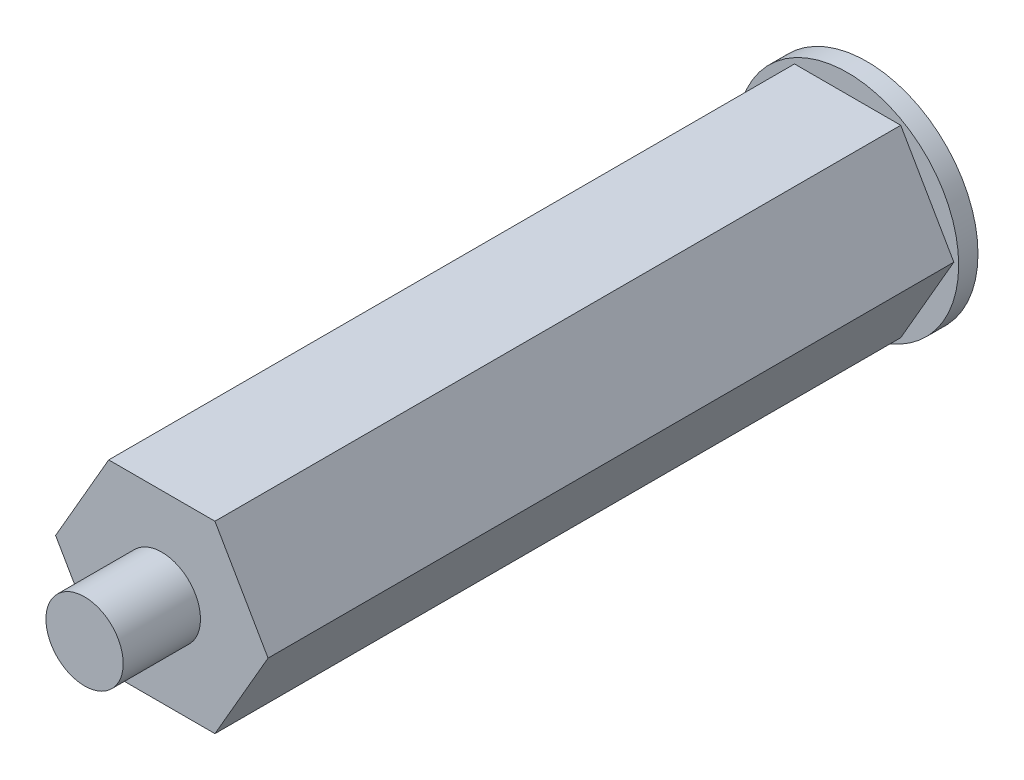
ISO-10303-21;
HEADER;
FILE_DESCRIPTION(('STEP AP214'),'2;1');
FILE_NAME('part.step','',(''),(''),'','','');
FILE_SCHEMA(('AUTOMOTIVE_DESIGN { 1 0 10303 214 1 1 1 1 }'));
ENDSEC;
DATA;
#1=APPLICATION_CONTEXT('core data for automotive mechanical design processes');
#2=APPLICATION_PROTOCOL_DEFINITION('international standard','automotive_design',2000,#1);
#3=PRODUCT_CONTEXT('',#1,'mechanical');
#4=PRODUCT('Part','Part','',(#3));
#5=PRODUCT_RELATED_PRODUCT_CATEGORY('part','',(#4));
#6=PRODUCT_DEFINITION_FORMATION('','',#4);
#7=PRODUCT_DEFINITION_CONTEXT('part definition',#1,'design');
#8=PRODUCT_DEFINITION('design','',#6,#7);
#9=PRODUCT_DEFINITION_SHAPE('','',#8);
#10=(LENGTH_UNIT() NAMED_UNIT(*) SI_UNIT(.MILLI.,.METRE.));
#11=(NAMED_UNIT(*) PLANE_ANGLE_UNIT() SI_UNIT($,.RADIAN.));
#12=(NAMED_UNIT(*) SI_UNIT($,.STERADIAN.) SOLID_ANGLE_UNIT());
#13=UNCERTAINTY_MEASURE_WITH_UNIT(LENGTH_MEASURE(1.E-05),#10,'distance_accuracy_value','');
#14=(GEOMETRIC_REPRESENTATION_CONTEXT(3) GLOBAL_UNCERTAINTY_ASSIGNED_CONTEXT((#13)) GLOBAL_UNIT_ASSIGNED_CONTEXT((#10,
#11,#12)) REPRESENTATION_CONTEXT('',''));
#15=CARTESIAN_POINT('',(0.,0.,0.));
#16=DIRECTION('',(0.,0.,1.));
#17=DIRECTION('',(1.,0.,0.));
#18=AXIS2_PLACEMENT_3D('',#15,#16,#17);
#19=CARTESIAN_POINT('',(0.,0.,-35.5));
#20=DIRECTION('',(0.,0.,1.));
#21=DIRECTION('',(1.,0.,0.));
#22=AXIS2_PLACEMENT_3D('',#19,#20,#21);
#23=PLANE('',#22);
#24=DIRECTION('',(0.5,0.866025403784438,0.));
#25=VECTOR('',#24,1.);
#26=CARTESIAN_POINT('',(-7.1014083110324,0.,-35.5));
#27=LINE('',#26,#25);
#28=CARTESIAN_POINT('',(-7.1014083110324,0.,-35.5));
#29=VERTEX_POINT('',#28);
#30=CARTESIAN_POINT('',(-3.5507041555162,6.15,-35.5));
#31=VERTEX_POINT('',#30);
#32=EDGE_CURVE('E275',#29,#31,#27,.T.);
#33=ORIENTED_EDGE('',*,*,#32,.F.);
#34=DIRECTION('',(-0.5,0.866025403784439,0.));
#35=VECTOR('',#34,1.);
#36=CARTESIAN_POINT('',(-3.5507041555162,-6.15,-35.5));
#37=LINE('',#36,#35);
#38=CARTESIAN_POINT('',(-3.5507041555162,-6.15,-35.5));
#39=VERTEX_POINT('',#38);
#40=EDGE_CURVE('E56',#39,#29,#37,.T.);
#41=ORIENTED_EDGE('',*,*,#40,.F.);
#42=DIRECTION('',(-1.,0.,0.));
#43=VECTOR('',#42,1.);
#44=CARTESIAN_POINT('',(3.5507041555162,-6.15,-35.5));
#45=LINE('',#44,#43);
#46=CARTESIAN_POINT('',(3.5507041555162,-6.15,-35.5));
#47=VERTEX_POINT('',#46);
#48=EDGE_CURVE('E295',#47,#39,#45,.T.);
#49=ORIENTED_EDGE('',*,*,#48,.F.);
#50=DIRECTION('',(-0.5,-0.866025403784438,0.));
#51=VECTOR('',#50,1.);
#52=CARTESIAN_POINT('',(7.1014083110324,0.,-35.5));
#53=LINE('',#52,#51);
#54=CARTESIAN_POINT('',(7.1014083110324,0.,-35.5));
#55=VERTEX_POINT('',#54);
#56=EDGE_CURVE('E289',#55,#47,#53,.T.);
#57=ORIENTED_EDGE('',*,*,#56,.F.);
#58=DIRECTION('',(0.5,-0.866025403784438,0.));
#59=VECTOR('',#58,1.);
#60=CARTESIAN_POINT('',(3.5507041555162,6.15,-35.5));
#61=LINE('',#60,#59);
#62=CARTESIAN_POINT('',(3.5507041555162,6.15,-35.5));
#63=VERTEX_POINT('',#62);
#64=EDGE_CURVE('E287',#63,#55,#61,.T.);
#65=ORIENTED_EDGE('',*,*,#64,.F.);
#66=DIRECTION('',(1.,0.,0.));
#67=VECTOR('',#66,1.);
#68=CARTESIAN_POINT('',(-3.5507041555162,6.15,-35.5));
#69=LINE('',#68,#67);
#70=EDGE_CURVE('E281',#31,#63,#69,.T.);
#71=ORIENTED_EDGE('',*,*,#70,.F.);
#72=EDGE_LOOP('',(#33,#41,#49,#57,#65,#71));
#73=FACE_BOUND('',#72,.T.);
#74=CARTESIAN_POINT('',(0.,0.,-35.5));
#75=DIRECTION('',(0.,0.,-1.));
#76=DIRECTION('',(-1.,0.,0.));
#77=AXIS2_PLACEMENT_3D('',#74,#75,#76);
#78=CIRCLE('',#77,8.5);
#79=CARTESIAN_POINT('',(-8.5,0.,-35.5));
#80=VERTEX_POINT('',#79);
#81=EDGE_CURVE('E327',#80,#80,#78,.T.);
#82=ORIENTED_EDGE('',*,*,#81,.T.);
#83=EDGE_LOOP('',(#82));
#84=FACE_BOUND('',#83,.T.);
#85=ADVANCED_FACE('F39',(#73,#84),#23,.F.);
#86=CARTESIAN_POINT('',(-3.5507041555162,-6.15,-29.5));
#87=DIRECTION('',(-0.866025403784439,-0.5,0.));
#88=DIRECTION('',(0.5,-0.866025403784439,0.));
#89=AXIS2_PLACEMENT_3D('',#86,#87,#88);
#90=PLANE('',#89);
#91=ORIENTED_EDGE('',*,*,#40,.T.);
#92=DIRECTION('',(0.,0.,-1.));
#93=VECTOR('',#92,1.);
#94=CARTESIAN_POINT('',(-7.1014083110324,0.,-29.5));
#95=LINE('',#94,#93);
#96=CARTESIAN_POINT('',(-7.1014083110324,0.,-29.5));
#97=VERTEX_POINT('',#96);
#98=EDGE_CURVE('E280',#97,#29,#95,.T.);
#99=ORIENTED_EDGE('',*,*,#98,.F.);
#100=DIRECTION('',(-0.5,0.866025403784439,0.));
#101=VECTOR('',#100,1.);
#102=CARTESIAN_POINT('',(-3.5507041555162,-6.15,-29.5));
#103=LINE('',#102,#101);
#104=CARTESIAN_POINT('',(-3.5507041555162,-6.15,-29.5));
#105=VERTEX_POINT('',#104);
#106=EDGE_CURVE('E298',#105,#97,#103,.T.);
#107=ORIENTED_EDGE('',*,*,#106,.F.);
#108=DIRECTION('',(0.,0.,-1.));
#109=VECTOR('',#108,1.);
#110=CARTESIAN_POINT('',(-3.5507041555162,-6.15,-29.5));
#111=LINE('',#110,#109);
#112=EDGE_CURVE('E299',#105,#39,#111,.T.);
#113=ORIENTED_EDGE('',*,*,#112,.T.);
#114=EDGE_LOOP('',(#91,#99,#107,#113));
#115=FACE_BOUND('',#114,.T.);
#116=ADVANCED_FACE('F204',(#115),#90,.F.);
#117=CARTESIAN_POINT('',(3.5507041555162,-6.15,-29.5));
#118=DIRECTION('',(0.,-1.,0.));
#119=DIRECTION('',(1.,0.,0.));
#120=AXIS2_PLACEMENT_3D('',#117,#118,#119);
#121=PLANE('',#120);
#122=ORIENTED_EDGE('',*,*,#48,.T.);
#123=ORIENTED_EDGE('',*,*,#112,.F.);
#124=DIRECTION('',(-1.,0.,0.));
#125=VECTOR('',#124,1.);
#126=CARTESIAN_POINT('',(3.5507041555162,-6.15,-29.5));
#127=LINE('',#126,#125);
#128=CARTESIAN_POINT('',(3.5507041555162,-6.15,-29.5));
#129=VERTEX_POINT('',#128);
#130=EDGE_CURVE('E308',#129,#105,#127,.T.);
#131=ORIENTED_EDGE('',*,*,#130,.F.);
#132=DIRECTION('',(0.,0.,-1.));
#133=VECTOR('',#132,1.);
#134=CARTESIAN_POINT('',(3.5507041555162,-6.15,-29.5));
#135=LINE('',#134,#133);
#136=EDGE_CURVE('E301',#129,#47,#135,.T.);
#137=ORIENTED_EDGE('',*,*,#136,.T.);
#138=EDGE_LOOP('',(#122,#123,#131,#137));
#139=FACE_BOUND('',#138,.T.);
#140=ADVANCED_FACE('F212',(#139),#121,.F.);
#141=CARTESIAN_POINT('',(7.1014083110324,0.,-29.5));
#142=DIRECTION('',(0.866025403784438,-0.5,0.));
#143=DIRECTION('',(0.5,0.866025403784438,0.));
#144=AXIS2_PLACEMENT_3D('',#141,#142,#143);
#145=PLANE('',#144);
#146=ORIENTED_EDGE('',*,*,#56,.T.);
#147=ORIENTED_EDGE('',*,*,#136,.F.);
#148=DIRECTION('',(-0.5,-0.866025403784438,0.));
#149=VECTOR('',#148,1.);
#150=CARTESIAN_POINT('',(7.1014083110324,0.,-29.5));
#151=LINE('',#150,#149);
#152=CARTESIAN_POINT('',(7.1014083110324,0.,-29.5));
#153=VERTEX_POINT('',#152);
#154=EDGE_CURVE('E310',#153,#129,#151,.T.);
#155=ORIENTED_EDGE('',*,*,#154,.F.);
#156=DIRECTION('',(0.,0.,-1.));
#157=VECTOR('',#156,1.);
#158=CARTESIAN_POINT('',(7.1014083110324,0.,-29.5));
#159=LINE('',#158,#157);
#160=EDGE_CURVE('E303',#153,#55,#159,.T.);
#161=ORIENTED_EDGE('',*,*,#160,.T.);
#162=EDGE_LOOP('',(#146,#147,#155,#161));
#163=FACE_BOUND('',#162,.T.);
#164=ADVANCED_FACE('F257',(#163),#145,.F.);
#165=CARTESIAN_POINT('',(3.5507041555162,6.15,-29.5));
#166=DIRECTION('',(0.866025403784439,0.5,0.));
#167=DIRECTION('',(-0.5,0.866025403784439,0.));
#168=AXIS2_PLACEMENT_3D('',#165,#166,#167);
#169=PLANE('',#168);
#170=ORIENTED_EDGE('',*,*,#64,.T.);
#171=ORIENTED_EDGE('',*,*,#160,.F.);
#172=DIRECTION('',(0.5,-0.866025403784438,0.));
#173=VECTOR('',#172,1.);
#174=CARTESIAN_POINT('',(3.5507041555162,6.15,-29.5));
#175=LINE('',#174,#173);
#176=CARTESIAN_POINT('',(3.5507041555162,6.15,-29.5));
#177=VERTEX_POINT('',#176);
#178=EDGE_CURVE('E315',#177,#153,#175,.T.);
#179=ORIENTED_EDGE('',*,*,#178,.F.);
#180=DIRECTION('',(0.,0.,-1.));
#181=VECTOR('',#180,1.);
#182=CARTESIAN_POINT('',(3.5507041555162,6.15,-29.5));
#183=LINE('',#182,#181);
#184=EDGE_CURVE('E305',#177,#63,#183,.T.);
#185=ORIENTED_EDGE('',*,*,#184,.T.);
#186=EDGE_LOOP('',(#170,#171,#179,#185));
#187=FACE_BOUND('',#186,.T.);
#188=ADVANCED_FACE('F261',(#187),#169,.F.);
#189=CARTESIAN_POINT('',(-3.5507041555162,6.15,-29.5));
#190=DIRECTION('',(0.,1.,0.));
#191=DIRECTION('',(0.,0.,1.));
#192=AXIS2_PLACEMENT_3D('',#189,#190,#191);
#193=PLANE('',#192);
#194=ORIENTED_EDGE('',*,*,#70,.T.);
#195=ORIENTED_EDGE('',*,*,#184,.F.);
#196=DIRECTION('',(1.,0.,0.));
#197=VECTOR('',#196,1.);
#198=CARTESIAN_POINT('',(-3.5507041555162,6.15,-29.5));
#199=LINE('',#198,#197);
#200=CARTESIAN_POINT('',(-3.5507041555162,6.15,-29.5));
#201=VERTEX_POINT('',#200);
#202=EDGE_CURVE('E334',#201,#177,#199,.T.);
#203=ORIENTED_EDGE('',*,*,#202,.F.);
#204=DIRECTION('',(0.,0.,-1.));
#205=VECTOR('',#204,1.);
#206=CARTESIAN_POINT('',(-3.5507041555162,6.15,-29.5));
#207=LINE('',#206,#205);
#208=EDGE_CURVE('E278',#201,#31,#207,.T.);
#209=ORIENTED_EDGE('',*,*,#208,.T.);
#210=EDGE_LOOP('',(#194,#195,#203,#209));
#211=FACE_BOUND('',#210,.T.);
#212=ADVANCED_FACE('F265',(#211),#193,.F.);
#213=CARTESIAN_POINT('',(-7.1014083110324,0.,-29.5));
#214=DIRECTION('',(-0.866025403784439,0.5,0.));
#215=DIRECTION('',(-0.5,-0.866025403784439,0.));
#216=AXIS2_PLACEMENT_3D('',#213,#214,#215);
#217=PLANE('',#216);
#218=ORIENTED_EDGE('',*,*,#32,.T.);
#219=ORIENTED_EDGE('',*,*,#208,.F.);
#220=DIRECTION('',(0.5,0.866025403784438,0.));
#221=VECTOR('',#220,1.);
#222=CARTESIAN_POINT('',(-7.1014083110324,0.,-29.5));
#223=LINE('',#222,#221);
#224=EDGE_CURVE('E331',#97,#201,#223,.T.);
#225=ORIENTED_EDGE('',*,*,#224,.F.);
#226=ORIENTED_EDGE('',*,*,#98,.T.);
#227=EDGE_LOOP('',(#218,#219,#225,#226));
#228=FACE_BOUND('',#227,.T.);
#229=ADVANCED_FACE('F253',(#228),#217,.F.);
#230=CARTESIAN_POINT('',(0.,0.,-29.5));
#231=DIRECTION('',(0.,0.,-1.));
#232=DIRECTION('',(-1.,0.,0.));
#233=AXIS2_PLACEMENT_3D('',#230,#231,#232);
#234=PLANE('',#233);
#235=ORIENTED_EDGE('',*,*,#106,.T.);
#236=ORIENTED_EDGE('',*,*,#224,.T.);
#237=ORIENTED_EDGE('',*,*,#202,.T.);
#238=ORIENTED_EDGE('',*,*,#178,.T.);
#239=ORIENTED_EDGE('',*,*,#154,.T.);
#240=ORIENTED_EDGE('',*,*,#130,.T.);
#241=EDGE_LOOP('',(#235,#236,#237,#238,#239,#240));
#242=FACE_BOUND('',#241,.T.);
#243=ADVANCED_FACE('F245',(#242),#234,.T.);
#244=CARTESIAN_POINT('',(0.,0.,-37.5));
#245=DIRECTION('',(0.,0.,-1.));
#246=DIRECTION('',(-1.,0.,0.));
#247=AXIS2_PLACEMENT_3D('',#244,#245,#246);
#248=PLANE('',#247);
#249=CARTESIAN_POINT('',(0.,0.,-37.5));
#250=DIRECTION('',(0.,0.,-1.));
#251=DIRECTION('',(-1.,0.,0.));
#252=AXIS2_PLACEMENT_3D('',#249,#250,#251);
#253=CIRCLE('',#252,11.5);
#254=CARTESIAN_POINT('',(-11.5,0.,-37.5));
#255=VERTEX_POINT('',#254);
#256=EDGE_CURVE('E318',#255,#255,#253,.T.);
#257=ORIENTED_EDGE('',*,*,#256,.T.);
#258=EDGE_LOOP('',(#257));
#259=FACE_BOUND('',#258,.T.);
#260=CARTESIAN_POINT('',(0.,0.,-37.5));
#261=DIRECTION('',(0.,0.,-1.));
#262=DIRECTION('',(-1.,0.,0.));
#263=AXIS2_PLACEMENT_3D('',#260,#261,#262);
#264=CIRCLE('',#263,8.5);
#265=CARTESIAN_POINT('',(-8.5,0.,-37.5));
#266=VERTEX_POINT('',#265);
#267=EDGE_CURVE('E324',#266,#266,#264,.T.);
#268=ORIENTED_EDGE('',*,*,#267,.F.);
#269=EDGE_LOOP('',(#268));
#270=FACE_BOUND('',#269,.T.);
#271=ADVANCED_FACE('F243',(#259,#270),#248,.T.);
#272=CARTESIAN_POINT('',(0.,0.,-35.5));
#273=DIRECTION('',(0.,0.,-1.));
#274=DIRECTION('',(-1.,0.,0.));
#275=AXIS2_PLACEMENT_3D('',#272,#273,#274);
#276=PLANE('',#275);
#277=DIRECTION('',(0.499999999999999,0.866025403784439,0.));
#278=VECTOR('',#277,1.);
#279=CARTESIAN_POINT('',(5.49926131403118,-9.525,-35.5));
#280=LINE('',#279,#278);
#281=CARTESIAN_POINT('',(5.49926131403118,-9.525,-35.5));
#282=VERTEX_POINT('',#281);
#283=CARTESIAN_POINT('',(10.9985226280624,0.,-35.5));
#284=VERTEX_POINT('',#283);
#285=EDGE_CURVE('E133',#282,#284,#280,.T.);
#286=ORIENTED_EDGE('',*,*,#285,.F.);
#287=DIRECTION('',(1.,0.,0.));
#288=VECTOR('',#287,1.);
#289=CARTESIAN_POINT('',(-5.49926131403118,-9.525,-35.5));
#290=LINE('',#289,#288);
#291=CARTESIAN_POINT('',(-5.49926131403118,-9.525,-35.5));
#292=VERTEX_POINT('',#291);
#293=EDGE_CURVE('E145',#292,#282,#290,.T.);
#294=ORIENTED_EDGE('',*,*,#293,.F.);
#295=DIRECTION('',(0.5,-0.866025403784438,0.));
#296=VECTOR('',#295,1.);
#297=CARTESIAN_POINT('',(-10.9985226280624,0.,-35.5));
#298=LINE('',#297,#296);
#299=CARTESIAN_POINT('',(-10.9985226280624,0.,-35.5));
#300=VERTEX_POINT('',#299);
#301=EDGE_CURVE('E158',#300,#292,#298,.T.);
#302=ORIENTED_EDGE('',*,*,#301,.F.);
#303=DIRECTION('',(-0.5,-0.866025403784439,0.));
#304=VECTOR('',#303,1.);
#305=CARTESIAN_POINT('',(-5.49926131403119,9.525,-35.5));
#306=LINE('',#305,#304);
#307=CARTESIAN_POINT('',(-5.49926131403119,9.525,-35.5));
#308=VERTEX_POINT('',#307);
#309=EDGE_CURVE('E155',#308,#300,#306,.T.);
#310=ORIENTED_EDGE('',*,*,#309,.F.);
#311=DIRECTION('',(-1.,0.,0.));
#312=VECTOR('',#311,1.);
#313=CARTESIAN_POINT('',(5.49926131403118,9.525,-35.5));
#314=LINE('',#313,#312);
#315=CARTESIAN_POINT('',(5.49926131403118,9.525,-35.5));
#316=VERTEX_POINT('',#315);
#317=EDGE_CURVE('E64',#316,#308,#314,.T.);
#318=ORIENTED_EDGE('',*,*,#317,.F.);
#319=DIRECTION('',(-0.5,0.866025403784439,0.));
#320=VECTOR('',#319,1.);
#321=CARTESIAN_POINT('',(10.9985226280624,0.,-35.5));
#322=LINE('',#321,#320);
#323=EDGE_CURVE('E128',#284,#316,#322,.T.);
#324=ORIENTED_EDGE('',*,*,#323,.F.);
#325=EDGE_LOOP('',(#286,#294,#302,#310,#318,#324));
#326=FACE_BOUND('',#325,.T.);
#327=CARTESIAN_POINT('',(0.,0.,-35.5));
#328=DIRECTION('',(0.,0.,-1.));
#329=DIRECTION('',(-1.,0.,0.));
#330=AXIS2_PLACEMENT_3D('',#327,#328,#329);
#331=CIRCLE('',#330,11.5);
#332=CARTESIAN_POINT('',(-11.5,0.,-35.5));
#333=VERTEX_POINT('',#332);
#334=EDGE_CURVE('E320',#333,#333,#331,.T.);
#335=ORIENTED_EDGE('',*,*,#334,.F.);
#336=EDGE_LOOP('',(#335));
#337=FACE_BOUND('',#336,.T.);
#338=ADVANCED_FACE('F130',(#326,#337),#276,.F.);
#339=CARTESIAN_POINT('',(0.,0.,-37.5));
#340=DIRECTION('',(0.,0.,1.));
#341=DIRECTION('',(1.,0.,0.));
#342=AXIS2_PLACEMENT_3D('',#339,#340,#341);
#343=CYLINDRICAL_SURFACE('',#342,11.5);
#344=ORIENTED_EDGE('',*,*,#256,.F.);
#345=EDGE_LOOP('',(#344));
#346=FACE_BOUND('',#345,.T.);
#347=ORIENTED_EDGE('',*,*,#334,.T.);
#348=EDGE_LOOP('',(#347));
#349=FACE_BOUND('',#348,.T.);
#350=ADVANCED_FACE('F241',(#346,#349),#343,.T.);
#351=CARTESIAN_POINT('',(0.,0.,-37.5));
#352=DIRECTION('',(0.,0.,1.));
#353=DIRECTION('',(1.,0.,0.));
#354=AXIS2_PLACEMENT_3D('',#351,#352,#353);
#355=CYLINDRICAL_SURFACE('',#354,8.5);
#356=ORIENTED_EDGE('',*,*,#267,.T.);
#357=EDGE_LOOP('',(#356));
#358=FACE_BOUND('',#357,.T.);
#359=ORIENTED_EDGE('',*,*,#81,.F.);
#360=EDGE_LOOP('',(#359));
#361=FACE_BOUND('',#360,.T.);
#362=ADVANCED_FACE('F238',(#358,#361),#355,.F.);
#363=CARTESIAN_POINT('',(0.,0.,35.5));
#364=DIRECTION('',(0.,0.,1.));
#365=DIRECTION('',(1.,0.,0.));
#366=AXIS2_PLACEMENT_3D('',#363,#364,#365);
#367=PLANE('',#366);
#368=CARTESIAN_POINT('',(0.,0.,35.5));
#369=DIRECTION('',(0.,0.,1.));
#370=DIRECTION('',(1.,0.,0.));
#371=AXIS2_PLACEMENT_3D('',#368,#369,#370);
#372=CIRCLE('',#371,4.);
#373=CARTESIAN_POINT('',(4.,0.,35.5));
#374=VERTEX_POINT('',#373);
#375=EDGE_CURVE('E11',#374,#374,#372,.T.);
#376=ORIENTED_EDGE('',*,*,#375,.F.);
#377=EDGE_LOOP('',(#376));
#378=FACE_BOUND('',#377,.T.);
#379=DIRECTION('',(0.499999999999999,0.866025403784439,0.));
#380=VECTOR('',#379,1.);
#381=CARTESIAN_POINT('',(5.49926131403118,-9.525,35.5));
#382=LINE('',#381,#380);
#383=CARTESIAN_POINT('',(5.49926131403118,-9.525,35.5));
#384=VERTEX_POINT('',#383);
#385=CARTESIAN_POINT('',(10.9985226280624,0.,35.5));
#386=VERTEX_POINT('',#385);
#387=EDGE_CURVE('E176',#384,#386,#382,.T.);
#388=ORIENTED_EDGE('',*,*,#387,.T.);
#389=DIRECTION('',(-0.5,0.866025403784439,0.));
#390=VECTOR('',#389,1.);
#391=CARTESIAN_POINT('',(10.9985226280624,0.,35.5));
#392=LINE('',#391,#390);
#393=CARTESIAN_POINT('',(5.49926131403118,9.525,35.5));
#394=VERTEX_POINT('',#393);
#395=EDGE_CURVE('E140',#386,#394,#392,.T.);
#396=ORIENTED_EDGE('',*,*,#395,.T.);
#397=DIRECTION('',(-1.,0.,0.));
#398=VECTOR('',#397,1.);
#399=CARTESIAN_POINT('',(5.49926131403118,9.525,35.5));
#400=LINE('',#399,#398);
#401=CARTESIAN_POINT('',(-5.49926131403119,9.525,35.5));
#402=VERTEX_POINT('',#401);
#403=EDGE_CURVE('E174',#394,#402,#400,.T.);
#404=ORIENTED_EDGE('',*,*,#403,.T.);
#405=DIRECTION('',(-0.5,-0.866025403784439,0.));
#406=VECTOR('',#405,1.);
#407=CARTESIAN_POINT('',(-5.49926131403119,9.525,35.5));
#408=LINE('',#407,#406);
#409=CARTESIAN_POINT('',(-10.9985226280624,0.,35.5));
#410=VERTEX_POINT('',#409);
#411=EDGE_CURVE('E180',#402,#410,#408,.T.);
#412=ORIENTED_EDGE('',*,*,#411,.T.);
#413=DIRECTION('',(0.5,-0.866025403784438,0.));
#414=VECTOR('',#413,1.);
#415=CARTESIAN_POINT('',(-10.9985226280624,0.,35.5));
#416=LINE('',#415,#414);
#417=CARTESIAN_POINT('',(-5.49926131403118,-9.525,35.5));
#418=VERTEX_POINT('',#417);
#419=EDGE_CURVE('E150',#410,#418,#416,.T.);
#420=ORIENTED_EDGE('',*,*,#419,.T.);
#421=DIRECTION('',(1.,0.,0.));
#422=VECTOR('',#421,1.);
#423=CARTESIAN_POINT('',(-5.49926131403118,-9.525,35.5));
#424=LINE('',#423,#422);
#425=EDGE_CURVE('E147',#418,#384,#424,.T.);
#426=ORIENTED_EDGE('',*,*,#425,.T.);
#427=EDGE_LOOP('',(#388,#396,#404,#412,#420,#426));
#428=FACE_BOUND('',#427,.T.);
#429=ADVANCED_FACE('F172',(#378,#428),#367,.T.);
#430=CARTESIAN_POINT('',(10.9985226280624,0.,-35.5));
#431=DIRECTION('',(0.866025403784439,0.5,0.));
#432=DIRECTION('',(-0.5,0.866025403784439,0.));
#433=AXIS2_PLACEMENT_3D('',#430,#431,#432);
#434=PLANE('',#433);
#435=DIRECTION('',(0.,0.,1.));
#436=VECTOR('',#435,1.);
#437=CARTESIAN_POINT('',(5.49926131403118,9.525,-35.5));
#438=LINE('',#437,#436);
#439=EDGE_CURVE('E144',#316,#394,#438,.T.);
#440=ORIENTED_EDGE('',*,*,#439,.T.);
#441=ORIENTED_EDGE('',*,*,#395,.F.);
#442=DIRECTION('',(0.,0.,1.));
#443=VECTOR('',#442,1.);
#444=CARTESIAN_POINT('',(10.9985226280624,0.,-35.5));
#445=LINE('',#444,#443);
#446=EDGE_CURVE('E43',#284,#386,#445,.T.);
#447=ORIENTED_EDGE('',*,*,#446,.F.);
#448=ORIENTED_EDGE('',*,*,#323,.T.);
#449=EDGE_LOOP('',(#440,#441,#447,#448));
#450=FACE_BOUND('',#449,.T.);
#451=ADVANCED_FACE('F138',(#450),#434,.T.);
#452=CARTESIAN_POINT('',(5.49926131403118,9.525,-35.5));
#453=DIRECTION('',(0.,1.,0.));
#454=DIRECTION('',(-1.,0.,0.));
#455=AXIS2_PLACEMENT_3D('',#452,#453,#454);
#456=PLANE('',#455);
#457=DIRECTION('',(0.,0.,1.));
#458=VECTOR('',#457,1.);
#459=CARTESIAN_POINT('',(-5.49926131403119,9.525,-35.5));
#460=LINE('',#459,#458);
#461=EDGE_CURVE('E167',#308,#402,#460,.T.);
#462=ORIENTED_EDGE('',*,*,#461,.T.);
#463=ORIENTED_EDGE('',*,*,#403,.F.);
#464=ORIENTED_EDGE('',*,*,#439,.F.);
#465=ORIENTED_EDGE('',*,*,#317,.T.);
#466=EDGE_LOOP('',(#462,#463,#464,#465));
#467=FACE_BOUND('',#466,.T.);
#468=ADVANCED_FACE('F178',(#467),#456,.T.);
#469=CARTESIAN_POINT('',(-5.49926131403119,9.525,-35.5));
#470=DIRECTION('',(-0.866025403784439,0.5,0.));
#471=DIRECTION('',(-0.5,-0.866025403784439,0.));
#472=AXIS2_PLACEMENT_3D('',#469,#470,#471);
#473=PLANE('',#472);
#474=DIRECTION('',(0.,0.,1.));
#475=VECTOR('',#474,1.);
#476=CARTESIAN_POINT('',(-10.9985226280624,0.,-35.5));
#477=LINE('',#476,#475);
#478=EDGE_CURVE('E165',#300,#410,#477,.T.);
#479=ORIENTED_EDGE('',*,*,#478,.T.);
#480=ORIENTED_EDGE('',*,*,#411,.F.);
#481=ORIENTED_EDGE('',*,*,#461,.F.);
#482=ORIENTED_EDGE('',*,*,#309,.T.);
#483=EDGE_LOOP('',(#479,#480,#481,#482));
#484=FACE_BOUND('',#483,.T.);
#485=ADVANCED_FACE('F194',(#484),#473,.T.);
#486=CARTESIAN_POINT('',(-10.9985226280624,0.,-35.5));
#487=DIRECTION('',(-0.866025403784438,-0.5,0.));
#488=DIRECTION('',(0.5,-0.866025403784439,0.));
#489=AXIS2_PLACEMENT_3D('',#486,#487,#488);
#490=PLANE('',#489);
#491=DIRECTION('',(0.,0.,1.));
#492=VECTOR('',#491,1.);
#493=CARTESIAN_POINT('',(-5.49926131403118,-9.525,-35.5));
#494=LINE('',#493,#492);
#495=EDGE_CURVE('E163',#292,#418,#494,.T.);
#496=ORIENTED_EDGE('',*,*,#495,.T.);
#497=ORIENTED_EDGE('',*,*,#419,.F.);
#498=ORIENTED_EDGE('',*,*,#478,.F.);
#499=ORIENTED_EDGE('',*,*,#301,.T.);
#500=EDGE_LOOP('',(#496,#497,#498,#499));
#501=FACE_BOUND('',#500,.T.);
#502=ADVANCED_FACE('F192',(#501),#490,.T.);
#503=CARTESIAN_POINT('',(-5.49926131403118,-9.525,-35.5));
#504=DIRECTION('',(0.,-1.,0.));
#505=DIRECTION('',(0.,0.,-1.));
#506=AXIS2_PLACEMENT_3D('',#503,#504,#505);
#507=PLANE('',#506);
#508=DIRECTION('',(0.,0.,1.));
#509=VECTOR('',#508,1.);
#510=CARTESIAN_POINT('',(5.49926131403118,-9.525,-35.5));
#511=LINE('',#510,#509);
#512=EDGE_CURVE('E48',#282,#384,#511,.T.);
#513=ORIENTED_EDGE('',*,*,#512,.T.);
#514=ORIENTED_EDGE('',*,*,#425,.F.);
#515=ORIENTED_EDGE('',*,*,#495,.F.);
#516=ORIENTED_EDGE('',*,*,#293,.T.);
#517=EDGE_LOOP('',(#513,#514,#515,#516));
#518=FACE_BOUND('',#517,.T.);
#519=ADVANCED_FACE('F191',(#518),#507,.T.);
#520=CARTESIAN_POINT('',(5.49926131403118,-9.525,-35.5));
#521=DIRECTION('',(0.866025403784439,-0.499999999999999,0.));
#522=DIRECTION('',(0.5,0.866025403784439,0.));
#523=AXIS2_PLACEMENT_3D('',#520,#521,#522);
#524=PLANE('',#523);
#525=ORIENTED_EDGE('',*,*,#446,.T.);
#526=ORIENTED_EDGE('',*,*,#387,.F.);
#527=ORIENTED_EDGE('',*,*,#512,.F.);
#528=ORIENTED_EDGE('',*,*,#285,.T.);
#529=EDGE_LOOP('',(#525,#526,#527,#528));
#530=FACE_BOUND('',#529,.T.);
#531=ADVANCED_FACE('F41',(#530),#524,.T.);
#532=CARTESIAN_POINT('',(0.,0.,43.5));
#533=DIRECTION('',(0.,0.,-1.));
#534=DIRECTION('',(-1.,0.,0.));
#535=AXIS2_PLACEMENT_3D('',#532,#533,#534);
#536=CYLINDRICAL_SURFACE('',#535,4.);
#537=CARTESIAN_POINT('',(0.,0.,43.5));
#538=DIRECTION('',(0.,0.,1.));
#539=DIRECTION('',(1.,0.,0.));
#540=AXIS2_PLACEMENT_3D('',#537,#538,#539);
#541=CIRCLE('',#540,4.);
#542=CARTESIAN_POINT('',(4.,0.,43.5));
#543=VERTEX_POINT('',#542);
#544=EDGE_CURVE('E342',#543,#543,#541,.T.);
#545=ORIENTED_EDGE('',*,*,#544,.F.);
#546=EDGE_LOOP('',(#545));
#547=FACE_BOUND('',#546,.T.);
#548=ORIENTED_EDGE('',*,*,#375,.T.);
#549=EDGE_LOOP('',(#548));
#550=FACE_BOUND('',#549,.T.);
#551=ADVANCED_FACE('F222',(#547,#550),#536,.T.);
#552=CARTESIAN_POINT('',(0.,0.,43.5));
#553=DIRECTION('',(0.,0.,1.));
#554=DIRECTION('',(1.,0.,0.));
#555=AXIS2_PLACEMENT_3D('',#552,#553,#554);
#556=PLANE('',#555);
#557=ORIENTED_EDGE('',*,*,#544,.T.);
#558=EDGE_LOOP('',(#557));
#559=FACE_BOUND('',#558,.T.);
#560=ADVANCED_FACE('F227',(#559),#556,.T.);
#561=CLOSED_SHELL('',(#85,#116,#140,#164,#188,#212,#229,#243,#271,#338,#350,#362,#429,#451,#468,
#485,#502,#519,#531,#551,#560));
#562=MANIFOLD_SOLID_BREP('B2',#561);
#563=ADVANCED_BREP_SHAPE_REPRESENTATION('',(#18,#562),#14);
#564=SHAPE_DEFINITION_REPRESENTATION(#9,#563);
ENDSEC;
END-ISO-10303-21;
